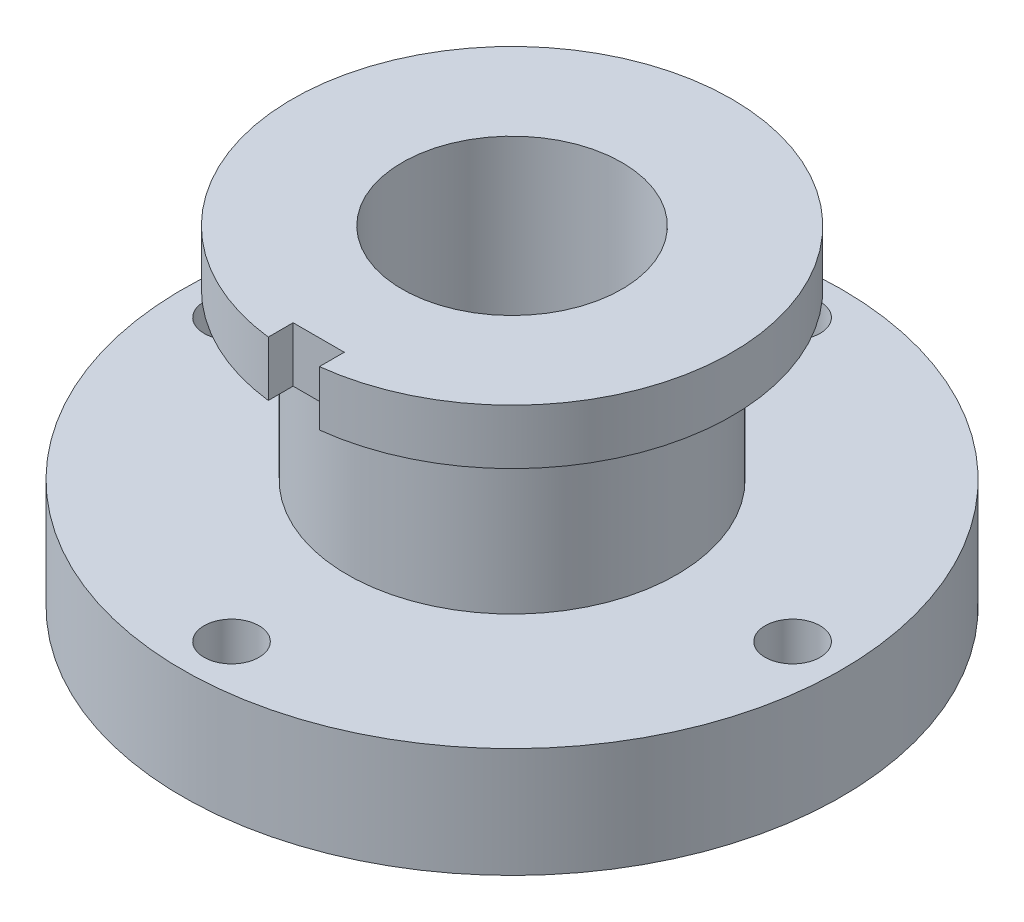
ISO-10303-21;
HEADER;
FILE_DESCRIPTION(('STEP AP214'),'2;1');
FILE_NAME('part.step','',(''),(''),'','','');
FILE_SCHEMA(('AUTOMOTIVE_DESIGN { 1 0 10303 214 1 1 1 1 }'));
ENDSEC;
DATA;
#1=APPLICATION_CONTEXT('core data for automotive mechanical design processes');
#2=APPLICATION_PROTOCOL_DEFINITION('international standard','automotive_design',2000,#1);
#3=PRODUCT_CONTEXT('',#1,'mechanical');
#4=PRODUCT('Part','Part','',(#3));
#5=PRODUCT_RELATED_PRODUCT_CATEGORY('part','',(#4));
#6=PRODUCT_DEFINITION_FORMATION('','',#4);
#7=PRODUCT_DEFINITION_CONTEXT('part definition',#1,'design');
#8=PRODUCT_DEFINITION('design','',#6,#7);
#9=PRODUCT_DEFINITION_SHAPE('','',#8);
#10=(LENGTH_UNIT() NAMED_UNIT(*) SI_UNIT(.MILLI.,.METRE.));
#11=(NAMED_UNIT(*) PLANE_ANGLE_UNIT() SI_UNIT($,.RADIAN.));
#12=(NAMED_UNIT(*) SI_UNIT($,.STERADIAN.) SOLID_ANGLE_UNIT());
#13=UNCERTAINTY_MEASURE_WITH_UNIT(LENGTH_MEASURE(1.E-05),#10,'distance_accuracy_value','');
#14=(GEOMETRIC_REPRESENTATION_CONTEXT(3) GLOBAL_UNCERTAINTY_ASSIGNED_CONTEXT((#13)) GLOBAL_UNIT_ASSIGNED_CONTEXT((#10,
#11,#12)) REPRESENTATION_CONTEXT('',''));
#15=CARTESIAN_POINT('',(0.,0.,0.));
#16=DIRECTION('',(0.,0.,1.));
#17=DIRECTION('',(1.,0.,0.));
#18=AXIS2_PLACEMENT_3D('',#15,#16,#17);
#19=CARTESIAN_POINT('',(0.,-251.612903225806,0.));
#20=DIRECTION('',(0.,-1.,0.));
#21=DIRECTION('',(0.,0.,-1.));
#22=AXIS2_PLACEMENT_3D('',#19,#20,#21);
#23=PLANE('',#22);
#24=CARTESIAN_POINT('',(0.,-251.612903225806,-255.365455534732));
#25=DIRECTION('',(0.,1.,0.));
#26=DIRECTION('',(0.,0.,1.));
#27=AXIS2_PLACEMENT_3D('',#24,#25,#26);
#28=CIRCLE('',#27,25.);
#29=CARTESIAN_POINT('',(0.,-251.612903225806,-230.365455534732));
#30=VERTEX_POINT('',#29);
#31=EDGE_CURVE('E106',#30,#30,#28,.T.);
#32=ORIENTED_EDGE('',*,*,#31,.T.);
#33=EDGE_LOOP('',(#32));
#34=FACE_BOUND('',#33,.T.);
#35=CARTESIAN_POINT('',(255.365455534739,-251.612903225806,-7.21101290261088E-12));
#36=DIRECTION('',(0.,1.,0.));
#37=DIRECTION('',(0.,0.,1.));
#38=AXIS2_PLACEMENT_3D('',#35,#36,#37);
#39=CIRCLE('',#38,25.0000000000057);
#40=CARTESIAN_POINT('',(255.365455534739,-251.612903225806,24.9999999999984));
#41=VERTEX_POINT('',#40);
#42=EDGE_CURVE('E113',#41,#41,#39,.T.);
#43=ORIENTED_EDGE('',*,*,#42,.T.);
#44=EDGE_LOOP('',(#43));
#45=FACE_BOUND('',#44,.T.);
#46=CARTESIAN_POINT('',(1.44220258052218E-11,-251.612903225806,255.365455534732));
#47=DIRECTION('',(0.,1.,0.));
#48=DIRECTION('',(0.,0.,1.));
#49=AXIS2_PLACEMENT_3D('',#46,#47,#48);
#50=CIRCLE('',#49,25.0000000000155);
#51=CARTESIAN_POINT('',(1.44220258052218E-11,-251.612903225806,280.365455534747));
#52=VERTEX_POINT('',#51);
#53=EDGE_CURVE('E119',#52,#52,#50,.T.);
#54=ORIENTED_EDGE('',*,*,#53,.T.);
#55=EDGE_LOOP('',(#54));
#56=FACE_BOUND('',#55,.T.);
#57=CARTESIAN_POINT('',(-255.365455534724,-251.612903225806,7.24228615138422E-12));
#58=DIRECTION('',(0.,1.,0.));
#59=DIRECTION('',(0.,0.,1.));
#60=AXIS2_PLACEMENT_3D('',#57,#58,#59);
#61=CIRCLE('',#60,25.0000000000116);
#62=CARTESIAN_POINT('',(-255.365455534724,-251.612903225806,25.0000000000188));
#63=VERTEX_POINT('',#62);
#64=EDGE_CURVE('E125',#63,#63,#61,.T.);
#65=ORIENTED_EDGE('',*,*,#64,.T.);
#66=EDGE_LOOP('',(#65));
#67=FACE_BOUND('',#66,.T.);
#68=CARTESIAN_POINT('',(0.,-251.612903225806,0.));
#69=DIRECTION('',(0.,-1.,0.));
#70=DIRECTION('',(0.,0.,-1.));
#71=AXIS2_PLACEMENT_3D('',#68,#69,#70);
#72=CIRCLE('',#71,300.);
#73=CARTESIAN_POINT('',(0.,-251.612903225806,-300.));
#74=VERTEX_POINT('',#73);
#75=EDGE_CURVE('E42',#74,#74,#72,.T.);
#76=ORIENTED_EDGE('',*,*,#75,.T.);
#77=EDGE_LOOP('',(#76));
#78=FACE_BOUND('',#77,.T.);
#79=ADVANCED_FACE('F35',(#34,#45,#56,#67,#78),#23,.T.);
#80=CARTESIAN_POINT('',(0.,-251.612903225806,0.));
#81=DIRECTION('',(0.,-1.,0.));
#82=DIRECTION('',(0.,0.,-1.));
#83=AXIS2_PLACEMENT_3D('',#80,#81,#82);
#84=CYLINDRICAL_SURFACE('',#83,300.);
#85=CARTESIAN_POINT('',(0.,-151.612903225806,0.));
#86=DIRECTION('',(0.,-1.,0.));
#87=DIRECTION('',(0.,0.,-1.));
#88=AXIS2_PLACEMENT_3D('',#85,#86,#87);
#89=CIRCLE('',#88,300.);
#90=CARTESIAN_POINT('',(0.,-151.612903225806,-300.));
#91=VERTEX_POINT('',#90);
#92=EDGE_CURVE('E145',#91,#91,#89,.T.);
#93=ORIENTED_EDGE('',*,*,#92,.T.);
#94=EDGE_LOOP('',(#93));
#95=FACE_BOUND('',#94,.T.);
#96=ORIENTED_EDGE('',*,*,#75,.F.);
#97=EDGE_LOOP('',(#96));
#98=FACE_BOUND('',#97,.T.);
#99=ADVANCED_FACE('F151',(#95,#98),#84,.T.);
#100=CARTESIAN_POINT('',(300.,-151.612903225806,0.));
#101=DIRECTION('',(0.,1.,0.));
#102=DIRECTION('',(0.,0.,1.));
#103=AXIS2_PLACEMENT_3D('',#100,#101,#102);
#104=PLANE('',#103);
#105=CARTESIAN_POINT('',(0.,-151.612903225806,-255.365455534732));
#106=DIRECTION('',(0.,1.,0.));
#107=DIRECTION('',(0.,0.,1.));
#108=AXIS2_PLACEMENT_3D('',#105,#106,#107);
#109=CIRCLE('',#108,25.);
#110=CARTESIAN_POINT('',(0.,-151.612903225806,-230.365455534732));
#111=VERTEX_POINT('',#110);
#112=EDGE_CURVE('E110',#111,#111,#109,.T.);
#113=ORIENTED_EDGE('',*,*,#112,.F.);
#114=EDGE_LOOP('',(#113));
#115=FACE_BOUND('',#114,.T.);
#116=CARTESIAN_POINT('',(255.365455534739,-151.612903225806,-7.21101290261088E-12));
#117=DIRECTION('',(0.,1.,0.));
#118=DIRECTION('',(0.,0.,1.));
#119=AXIS2_PLACEMENT_3D('',#116,#117,#118);
#120=CIRCLE('',#119,25.0000000000057);
#121=CARTESIAN_POINT('',(255.365455534739,-151.612903225806,24.9999999999984));
#122=VERTEX_POINT('',#121);
#123=EDGE_CURVE('E116',#122,#122,#120,.T.);
#124=ORIENTED_EDGE('',*,*,#123,.F.);
#125=EDGE_LOOP('',(#124));
#126=FACE_BOUND('',#125,.T.);
#127=CARTESIAN_POINT('',(1.44220258052218E-11,-151.612903225806,255.365455534732));
#128=DIRECTION('',(0.,1.,0.));
#129=DIRECTION('',(0.,0.,1.));
#130=AXIS2_PLACEMENT_3D('',#127,#128,#129);
#131=CIRCLE('',#130,25.0000000000155);
#132=CARTESIAN_POINT('',(1.44220258052218E-11,-151.612903225806,280.365455534747));
#133=VERTEX_POINT('',#132);
#134=EDGE_CURVE('E122',#133,#133,#131,.T.);
#135=ORIENTED_EDGE('',*,*,#134,.F.);
#136=EDGE_LOOP('',(#135));
#137=FACE_BOUND('',#136,.T.);
#138=CARTESIAN_POINT('',(-255.365455534724,-151.612903225806,7.24228615138422E-12));
#139=DIRECTION('',(0.,1.,0.));
#140=DIRECTION('',(0.,0.,1.));
#141=AXIS2_PLACEMENT_3D('',#138,#139,#140);
#142=CIRCLE('',#141,25.0000000000116);
#143=CARTESIAN_POINT('',(-255.365455534724,-151.612903225806,25.0000000000188));
#144=VERTEX_POINT('',#143);
#145=EDGE_CURVE('E105',#144,#144,#142,.T.);
#146=ORIENTED_EDGE('',*,*,#145,.F.);
#147=EDGE_LOOP('',(#146));
#148=FACE_BOUND('',#147,.T.);
#149=CARTESIAN_POINT('',(0.,-151.612903225806,0.));
#150=DIRECTION('',(0.,-1.,0.));
#151=DIRECTION('',(0.,0.,-1.));
#152=AXIS2_PLACEMENT_3D('',#149,#150,#151);
#153=CIRCLE('',#152,150.);
#154=CARTESIAN_POINT('',(0.,-151.612903225806,-150.));
#155=VERTEX_POINT('',#154);
#156=EDGE_CURVE('E142',#155,#155,#153,.T.);
#157=ORIENTED_EDGE('',*,*,#156,.T.);
#158=EDGE_LOOP('',(#157));
#159=FACE_BOUND('',#158,.T.);
#160=ORIENTED_EDGE('',*,*,#92,.F.);
#161=EDGE_LOOP('',(#160));
#162=FACE_BOUND('',#161,.T.);
#163=ADVANCED_FACE('F153',(#115,#126,#137,#148,#159,#162),#104,.T.);
#164=CARTESIAN_POINT('',(0.,-251.612903225806,0.));
#165=DIRECTION('',(0.,-1.,0.));
#166=DIRECTION('',(0.,0.,-1.));
#167=AXIS2_PLACEMENT_3D('',#164,#165,#166);
#168=CYLINDRICAL_SURFACE('',#167,150.);
#169=CARTESIAN_POINT('',(0.,-1.61290322580646,0.));
#170=DIRECTION('',(0.,-1.,0.));
#171=DIRECTION('',(0.,0.,-1.));
#172=AXIS2_PLACEMENT_3D('',#169,#170,#171);
#173=CIRCLE('',#172,150.);
#174=CARTESIAN_POINT('',(0.,-1.61290322580646,-150.));
#175=VERTEX_POINT('',#174);
#176=EDGE_CURVE('E139',#175,#175,#173,.T.);
#177=ORIENTED_EDGE('',*,*,#176,.T.);
#178=EDGE_LOOP('',(#177));
#179=FACE_BOUND('',#178,.T.);
#180=ORIENTED_EDGE('',*,*,#156,.F.);
#181=EDGE_LOOP('',(#180));
#182=FACE_BOUND('',#181,.T.);
#183=ADVANCED_FACE('F159',(#179,#182),#168,.T.);
#184=CARTESIAN_POINT('',(150.,-1.61290322580646,0.));
#185=DIRECTION('',(0.,-1.,0.));
#186=DIRECTION('',(0.,0.,-1.));
#187=AXIS2_PLACEMENT_3D('',#184,#185,#186);
#188=PLANE('',#187);
#189=DIRECTION('',(0.,0.,1.));
#190=VECTOR('',#189,1.);
#191=CARTESIAN_POINT('',(23.2765471371073,-1.61290322580646,0.));
#192=LINE('',#191,#190);
#193=CARTESIAN_POINT('',(23.2765471371073,-1.61290322580646,176.018131322176));
#194=VERTEX_POINT('',#193);
#195=CARTESIAN_POINT('',(23.2765471371072,-1.61290322580646,198.640887919315));
#196=VERTEX_POINT('',#195);
#197=EDGE_CURVE('E55',#194,#196,#192,.T.);
#198=ORIENTED_EDGE('',*,*,#197,.F.);
#199=DIRECTION('',(1.,0.,0.));
#200=VECTOR('',#199,1.);
#201=CARTESIAN_POINT('',(150.,-1.61290322580646,176.018131322176));
#202=LINE('',#201,#200);
#203=CARTESIAN_POINT('',(-23.2765471371073,-1.61290322580646,176.018131322176));
#204=VERTEX_POINT('',#203);
#205=EDGE_CURVE('E82',#204,#194,#202,.T.);
#206=ORIENTED_EDGE('',*,*,#205,.F.);
#207=DIRECTION('',(0.,0.,-1.));
#208=VECTOR('',#207,1.);
#209=CARTESIAN_POINT('',(-23.2765471371073,-1.61290322580646,0.));
#210=LINE('',#209,#208);
#211=CARTESIAN_POINT('',(-23.2765471371072,-1.61290322580646,198.640887919315));
#212=VERTEX_POINT('',#211);
#213=EDGE_CURVE('E80',#212,#204,#210,.T.);
#214=ORIENTED_EDGE('',*,*,#213,.F.);
#215=CARTESIAN_POINT('',(0.,-1.61290322580646,0.));
#216=DIRECTION('',(0.,-1.,0.));
#217=DIRECTION('',(0.,0.,-1.));
#218=AXIS2_PLACEMENT_3D('',#215,#216,#217);
#219=CIRCLE('',#218,200.);
#220=EDGE_CURVE('E136',#212,#196,#219,.T.);
#221=ORIENTED_EDGE('',*,*,#220,.T.);
#222=EDGE_LOOP('',(#198,#206,#214,#221));
#223=FACE_BOUND('',#222,.T.);
#224=ORIENTED_EDGE('',*,*,#176,.F.);
#225=EDGE_LOOP('',(#224));
#226=FACE_BOUND('',#225,.T.);
#227=ADVANCED_FACE('F166',(#223,#226),#188,.T.);
#228=CARTESIAN_POINT('',(0.,-251.612903225806,0.));
#229=DIRECTION('',(0.,-1.,0.));
#230=DIRECTION('',(0.,0.,-1.));
#231=AXIS2_PLACEMENT_3D('',#228,#229,#230);
#232=CYLINDRICAL_SURFACE('',#231,200.);
#233=DIRECTION('',(0.,-1.,0.));
#234=VECTOR('',#233,1.);
#235=CARTESIAN_POINT('',(23.2765471371072,-251.612903225806,198.640887919315));
#236=LINE('',#235,#234);
#237=CARTESIAN_POINT('',(23.2765471371073,48.3870967741935,198.640887919315));
#238=VERTEX_POINT('',#237);
#239=EDGE_CURVE('E102',#196,#238,#236,.F.);
#240=ORIENTED_EDGE('',*,*,#239,.F.);
#241=ORIENTED_EDGE('',*,*,#220,.F.);
#242=DIRECTION('',(0.,-1.,0.));
#243=VECTOR('',#242,1.);
#244=CARTESIAN_POINT('',(-23.2765471371072,-251.612903225806,198.640887919315));
#245=LINE('',#244,#243);
#246=CARTESIAN_POINT('',(-23.2765471371073,48.3870967741935,198.640887919315));
#247=VERTEX_POINT('',#246);
#248=EDGE_CURVE('E99',#247,#212,#245,.T.);
#249=ORIENTED_EDGE('',*,*,#248,.F.);
#250=CARTESIAN_POINT('',(0.,48.3870967741936,0.));
#251=DIRECTION('',(0.,-1.,0.));
#252=DIRECTION('',(0.,0.,-1.));
#253=AXIS2_PLACEMENT_3D('',#250,#251,#252);
#254=CIRCLE('',#253,200.);
#255=EDGE_CURVE('E94',#247,#238,#254,.T.);
#256=ORIENTED_EDGE('',*,*,#255,.T.);
#257=EDGE_LOOP('',(#240,#241,#249,#256));
#258=FACE_BOUND('',#257,.T.);
#259=ADVANCED_FACE('F170',(#258),#232,.T.);
#260=CARTESIAN_POINT('',(152.822580645162,48.3870967741935,0.));
#261=DIRECTION('',(0.,1.,0.));
#262=DIRECTION('',(0.,0.,1.));
#263=AXIS2_PLACEMENT_3D('',#260,#261,#262);
#264=PLANE('',#263);
#265=DIRECTION('',(0.,0.,-1.));
#266=VECTOR('',#265,1.);
#267=CARTESIAN_POINT('',(23.2765471371073,48.3870967741935,0.));
#268=LINE('',#267,#266);
#269=CARTESIAN_POINT('',(23.2765471371073,48.3870967741935,176.018131322176));
#270=VERTEX_POINT('',#269);
#271=EDGE_CURVE('E11',#238,#270,#268,.T.);
#272=ORIENTED_EDGE('',*,*,#271,.F.);
#273=ORIENTED_EDGE('',*,*,#255,.F.);
#274=DIRECTION('',(0.,0.,1.));
#275=VECTOR('',#274,1.);
#276=CARTESIAN_POINT('',(-23.2765471371073,48.3870967741935,176.018131322176));
#277=LINE('',#276,#275);
#278=CARTESIAN_POINT('',(-23.2765471371073,48.3870967741935,176.018131322176));
#279=VERTEX_POINT('',#278);
#280=EDGE_CURVE('E77',#279,#247,#277,.T.);
#281=ORIENTED_EDGE('',*,*,#280,.F.);
#282=DIRECTION('',(-1.,0.,0.));
#283=VECTOR('',#282,1.);
#284=CARTESIAN_POINT('',(-23.2765471371073,48.3870967741935,176.018131322176));
#285=LINE('',#284,#283);
#286=EDGE_CURVE('E85',#270,#279,#285,.T.);
#287=ORIENTED_EDGE('',*,*,#286,.F.);
#288=EDGE_LOOP('',(#272,#273,#281,#287));
#289=FACE_BOUND('',#288,.T.);
#290=CARTESIAN_POINT('',(0.,48.3870967741935,0.));
#291=DIRECTION('',(0.,-1.,0.));
#292=DIRECTION('',(0.,0.,-1.));
#293=AXIS2_PLACEMENT_3D('',#290,#291,#292);
#294=CIRCLE('',#293,100.);
#295=CARTESIAN_POINT('',(0.,48.3870967741935,-100.));
#296=VERTEX_POINT('',#295);
#297=EDGE_CURVE('E132',#296,#296,#294,.T.);
#298=ORIENTED_EDGE('',*,*,#297,.T.);
#299=EDGE_LOOP('',(#298));
#300=FACE_BOUND('',#299,.T.);
#301=ADVANCED_FACE('F91',(#289,#300),#264,.T.);
#302=CARTESIAN_POINT('',(0.,-251.612903225806,0.));
#303=DIRECTION('',(0.,-1.,0.));
#304=DIRECTION('',(0.,0.,-1.));
#305=AXIS2_PLACEMENT_3D('',#302,#303,#304);
#306=CYLINDRICAL_SURFACE('',#305,100.);
#307=CARTESIAN_POINT('',(0.,-151.612903225806,0.));
#308=DIRECTION('',(0.,-1.,0.));
#309=DIRECTION('',(0.,0.,-1.));
#310=AXIS2_PLACEMENT_3D('',#307,#308,#309);
#311=CIRCLE('',#310,100.);
#312=CARTESIAN_POINT('',(0.,-151.612903225806,-100.));
#313=VERTEX_POINT('',#312);
#314=EDGE_CURVE('E109',#313,#313,#311,.T.);
#315=ORIENTED_EDGE('',*,*,#314,.T.);
#316=EDGE_LOOP('',(#315));
#317=FACE_BOUND('',#316,.T.);
#318=ORIENTED_EDGE('',*,*,#297,.F.);
#319=EDGE_LOOP('',(#318));
#320=FACE_BOUND('',#319,.T.);
#321=ADVANCED_FACE('F177',(#317,#320),#306,.F.);
#322=CARTESIAN_POINT('',(100.,-151.612903225806,0.));
#323=DIRECTION('',(0.,1.,0.));
#324=DIRECTION('',(0.,0.,1.));
#325=AXIS2_PLACEMENT_3D('',#322,#323,#324);
#326=PLANE('',#325);
#327=ORIENTED_EDGE('',*,*,#314,.F.);
#328=EDGE_LOOP('',(#327));
#329=FACE_BOUND('',#328,.T.);
#330=ADVANCED_FACE('F180',(#329),#326,.T.);
#331=CARTESIAN_POINT('',(-255.365455534724,-251.612903225806,7.24228615138422E-12));
#332=DIRECTION('',(0.,1.,0.));
#333=DIRECTION('',(0.,0.,1.));
#334=AXIS2_PLACEMENT_3D('',#331,#332,#333);
#335=CYLINDRICAL_SURFACE('',#334,25.0000000000116);
#336=ORIENTED_EDGE('',*,*,#64,.F.);
#337=EDGE_LOOP('',(#336));
#338=FACE_BOUND('',#337,.T.);
#339=ORIENTED_EDGE('',*,*,#145,.T.);
#340=EDGE_LOOP('',(#339));
#341=FACE_BOUND('',#340,.T.);
#342=ADVANCED_FACE('F184',(#338,#341),#335,.F.);
#343=CARTESIAN_POINT('',(1.44220258052218E-11,-251.612903225806,255.365455534732));
#344=DIRECTION('',(0.,1.,0.));
#345=DIRECTION('',(0.,0.,1.));
#346=AXIS2_PLACEMENT_3D('',#343,#344,#345);
#347=CYLINDRICAL_SURFACE('',#346,25.0000000000155);
#348=ORIENTED_EDGE('',*,*,#53,.F.);
#349=EDGE_LOOP('',(#348));
#350=FACE_BOUND('',#349,.T.);
#351=ORIENTED_EDGE('',*,*,#134,.T.);
#352=EDGE_LOOP('',(#351));
#353=FACE_BOUND('',#352,.T.);
#354=ADVANCED_FACE('F188',(#350,#353),#347,.F.);
#355=CARTESIAN_POINT('',(255.365455534739,-251.612903225806,-7.21101290261088E-12));
#356=DIRECTION('',(0.,1.,0.));
#357=DIRECTION('',(0.,0.,1.));
#358=AXIS2_PLACEMENT_3D('',#355,#356,#357);
#359=CYLINDRICAL_SURFACE('',#358,25.0000000000057);
#360=ORIENTED_EDGE('',*,*,#42,.F.);
#361=EDGE_LOOP('',(#360));
#362=FACE_BOUND('',#361,.T.);
#363=ORIENTED_EDGE('',*,*,#123,.T.);
#364=EDGE_LOOP('',(#363));
#365=FACE_BOUND('',#364,.T.);
#366=ADVANCED_FACE('F192',(#362,#365),#359,.F.);
#367=CARTESIAN_POINT('',(0.,-251.612903225806,-255.365455534732));
#368=DIRECTION('',(0.,1.,0.));
#369=DIRECTION('',(0.,0.,1.));
#370=AXIS2_PLACEMENT_3D('',#367,#368,#369);
#371=CYLINDRICAL_SURFACE('',#370,25.);
#372=ORIENTED_EDGE('',*,*,#31,.F.);
#373=EDGE_LOOP('',(#372));
#374=FACE_BOUND('',#373,.T.);
#375=ORIENTED_EDGE('',*,*,#112,.T.);
#376=EDGE_LOOP('',(#375));
#377=FACE_BOUND('',#376,.T.);
#378=ADVANCED_FACE('F196',(#374,#377),#371,.F.);
#379=CARTESIAN_POINT('',(23.2765471371073,-11.6129032258065,176.018131322176));
#380=DIRECTION('',(1.,0.,0.));
#381=DIRECTION('',(0.,0.,-1.));
#382=AXIS2_PLACEMENT_3D('',#379,#380,#381);
#383=PLANE('',#382);
#384=ORIENTED_EDGE('',*,*,#197,.T.);
#385=ORIENTED_EDGE('',*,*,#239,.T.);
#386=ORIENTED_EDGE('',*,*,#271,.T.);
#387=DIRECTION('',(0.,1.,0.));
#388=VECTOR('',#387,1.);
#389=CARTESIAN_POINT('',(23.2765471371073,-11.6129032258065,176.018131322176));
#390=LINE('',#389,#388);
#391=EDGE_CURVE('E49',#194,#270,#390,.T.);
#392=ORIENTED_EDGE('',*,*,#391,.F.);
#393=EDGE_LOOP('',(#384,#385,#386,#392));
#394=FACE_BOUND('',#393,.T.);
#395=ADVANCED_FACE('F200',(#394),#383,.F.);
#396=CARTESIAN_POINT('',(-23.2765471371073,-11.6129032258065,176.018131322176));
#397=DIRECTION('',(-1.,0.,0.));
#398=DIRECTION('',(0.,0.,1.));
#399=AXIS2_PLACEMENT_3D('',#396,#397,#398);
#400=PLANE('',#399);
#401=ORIENTED_EDGE('',*,*,#213,.T.);
#402=DIRECTION('',(0.,1.,0.));
#403=VECTOR('',#402,1.);
#404=CARTESIAN_POINT('',(-23.2765471371073,-11.6129032258065,176.018131322176));
#405=LINE('',#404,#403);
#406=EDGE_CURVE('E74',#204,#279,#405,.T.);
#407=ORIENTED_EDGE('',*,*,#406,.T.);
#408=ORIENTED_EDGE('',*,*,#280,.T.);
#409=ORIENTED_EDGE('',*,*,#248,.T.);
#410=EDGE_LOOP('',(#401,#407,#408,#409));
#411=FACE_BOUND('',#410,.T.);
#412=ADVANCED_FACE('F75',(#411),#400,.F.);
#413=CARTESIAN_POINT('',(-23.2765471371073,-11.6129032258065,176.018131322176));
#414=DIRECTION('',(0.,0.,-1.));
#415=DIRECTION('',(-1.,0.,0.));
#416=AXIS2_PLACEMENT_3D('',#413,#414,#415);
#417=PLANE('',#416);
#418=ORIENTED_EDGE('',*,*,#205,.T.);
#419=ORIENTED_EDGE('',*,*,#391,.T.);
#420=ORIENTED_EDGE('',*,*,#286,.T.);
#421=ORIENTED_EDGE('',*,*,#406,.F.);
#422=EDGE_LOOP('',(#418,#419,#420,#421));
#423=FACE_BOUND('',#422,.T.);
#424=ADVANCED_FACE('F86',(#423),#417,.F.);
#425=CLOSED_SHELL('',(#79,#99,#163,#183,#227,#259,#301,#321,#330,#342,#354,#366,#378,#395,#412,#424));
#426=MANIFOLD_SOLID_BREP('B2',#425);
#427=ADVANCED_BREP_SHAPE_REPRESENTATION('',(#18,#426),#14);
#428=SHAPE_DEFINITION_REPRESENTATION(#9,#427);
ENDSEC;
END-ISO-10303-21;
